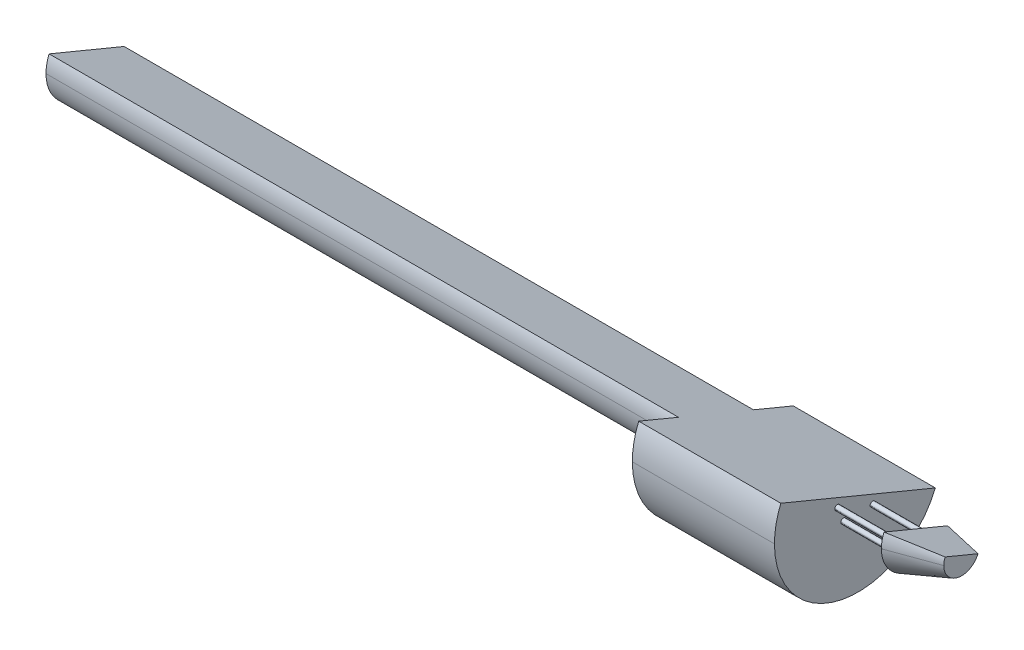
ISO-10303-21;
HEADER;
FILE_DESCRIPTION(('STEP AP214'),'2;1');
FILE_NAME('part.step','',(''),(''),'','','');
FILE_SCHEMA(('AUTOMOTIVE_DESIGN { 1 0 10303 214 1 1 1 1 }'));
ENDSEC;
DATA;
#1=APPLICATION_CONTEXT('core data for automotive mechanical design processes');
#2=APPLICATION_PROTOCOL_DEFINITION('international standard','automotive_design',2000,#1);
#3=PRODUCT_CONTEXT('',#1,'mechanical');
#4=PRODUCT('Part','Part','',(#3));
#5=PRODUCT_RELATED_PRODUCT_CATEGORY('part','',(#4));
#6=PRODUCT_DEFINITION_FORMATION('','',#4);
#7=PRODUCT_DEFINITION_CONTEXT('part definition',#1,'design');
#8=PRODUCT_DEFINITION('design','',#6,#7);
#9=PRODUCT_DEFINITION_SHAPE('','',#8);
#10=(LENGTH_UNIT() NAMED_UNIT(*) SI_UNIT(.MILLI.,.METRE.));
#11=(NAMED_UNIT(*) PLANE_ANGLE_UNIT() SI_UNIT($,.RADIAN.));
#12=(NAMED_UNIT(*) SI_UNIT($,.STERADIAN.) SOLID_ANGLE_UNIT());
#13=UNCERTAINTY_MEASURE_WITH_UNIT(LENGTH_MEASURE(1.E-05),#10,'distance_accuracy_value','');
#14=(GEOMETRIC_REPRESENTATION_CONTEXT(3) GLOBAL_UNCERTAINTY_ASSIGNED_CONTEXT((#13)) GLOBAL_UNIT_ASSIGNED_CONTEXT((#10,
#11,#12)) REPRESENTATION_CONTEXT('',''));
#15=CARTESIAN_POINT('',(0.,0.,0.));
#16=DIRECTION('',(0.,0.,1.));
#17=DIRECTION('',(1.,0.,0.));
#18=AXIS2_PLACEMENT_3D('',#15,#16,#17);
#19=CARTESIAN_POINT('',(0.,0.,0.));
#20=DIRECTION('',(0.,0.923879532511287,-0.382683432365091));
#21=DIRECTION('',(0.,0.382683432365091,0.923879532511286));
#22=AXIS2_PLACEMENT_3D('',#19,#20,#21);
#23=PLANE('',#22);
#24=DIRECTION('',(-0.939692506121897,-0.130885562945162,-0.315985701181046));
#25=VECTOR('',#24,1.);
#26=CARTESIAN_POINT('',(288.949201951219,0.,0.));
#27=LINE('',#26,#25);
#28=CARTESIAN_POINT('',(259.36,-4.12134749319908,-9.94981301333355));
#29=VERTEX_POINT('',#28);
#30=CARTESIAN_POINT('',(273.6661,-2.12871486087405,-5.13917228754728));
#31=VERTEX_POINT('',#30);
#32=EDGE_CURVE('E566',#29,#31,#27,.F.);
#33=ORIENTED_EDGE('',*,*,#32,.F.);
#34=DIRECTION('',(0.,-0.382683432365091,-0.923879532511286));
#35=VECTOR('',#34,1.);
#36=CARTESIAN_POINT('',(259.36,1.57717140466669,3.80762859533333));
#37=LINE('',#36,#35);
#38=CARTESIAN_POINT('',(259.36,4.12134749319908,9.94981301333355));
#39=VERTEX_POINT('',#38);
#40=EDGE_CURVE('E560',#39,#29,#37,.T.);
#41=ORIENTED_EDGE('',*,*,#40,.F.);
#42=DIRECTION('',(0.939692506121897,-0.130885562945162,-0.315985701181046));
#43=VECTOR('',#42,1.);
#44=CARTESIAN_POINT('',(288.949201951219,0.,0.));
#45=LINE('',#44,#43);
#46=CARTESIAN_POINT('',(273.6661,2.12871486087405,5.13917228754728));
#47=VERTEX_POINT('',#46);
#48=EDGE_CURVE('E556',#47,#39,#45,.F.);
#49=ORIENTED_EDGE('',*,*,#48,.F.);
#50=DIRECTION('',(0.,-0.382683432365091,-0.923879532511286));
#51=VECTOR('',#50,1.);
#52=CARTESIAN_POINT('',(273.6661,0.,0.));
#53=LINE('',#52,#51);
#54=EDGE_CURVE('E318',#47,#31,#53,.T.);
#55=ORIENTED_EDGE('',*,*,#54,.T.);
#56=EDGE_LOOP('',(#33,#41,#49,#55));
#57=FACE_BOUND('',#56,.T.);
#58=ADVANCED_FACE('F60',(#57),#23,.T.);
#59=DIRECTION('',(-1.,0.,0.));
#60=VECTOR('',#59,1.);
#61=CARTESIAN_POINT('',(0.,10.0117639575355,24.1705363295603));
#62=LINE('',#61,#60);
#63=CARTESIAN_POINT('',(241.3,10.0117639575355,24.1705363295603));
#64=VERTEX_POINT('',#63);
#65=CARTESIAN_POINT('',(196.85,10.0117639575355,24.1705363295603));
#66=VERTEX_POINT('',#65);
#67=EDGE_CURVE('E581',#64,#66,#62,.T.);
#68=ORIENTED_EDGE('',*,*,#67,.F.);
#69=DIRECTION('',(0.,0.382683432365091,0.923879532511286));
#70=VECTOR('',#69,1.);
#71=CARTESIAN_POINT('',(241.3,3.83133619529879,9.24966380470124));
#72=LINE('',#71,#70);
#73=CARTESIAN_POINT('',(241.3,-10.0117639575355,-24.1705363295603));
#74=VERTEX_POINT('',#73);
#75=EDGE_CURVE('E563',#74,#64,#72,.T.);
#76=ORIENTED_EDGE('',*,*,#75,.F.);
#77=DIRECTION('',(-1.,0.,0.));
#78=VECTOR('',#77,1.);
#79=CARTESIAN_POINT('',(0.,-10.0117639575355,-24.1705363295603));
#80=LINE('',#79,#78);
#81=CARTESIAN_POINT('',(196.85,-10.0117639575355,-24.1705363295603));
#82=VERTEX_POINT('',#81);
#83=EDGE_CURVE('E569',#82,#74,#80,.F.);
#84=ORIENTED_EDGE('',*,*,#83,.F.);
#85=DIRECTION('',(0.,-0.382683432365091,-0.923879532511286));
#86=VECTOR('',#85,1.);
#87=CARTESIAN_POINT('',(196.85,1.85987193946543,4.49012806053458));
#88=LINE('',#87,#86);
#89=CARTESIAN_POINT('',(196.85,-4.86007959103665,-11.7332700628933));
#90=VERTEX_POINT('',#89);
#91=EDGE_CURVE('E580',#90,#82,#88,.T.);
#92=ORIENTED_EDGE('',*,*,#91,.F.);
#93=DIRECTION('',(-1.,0.,0.));
#94=VECTOR('',#93,1.);
#95=CARTESIAN_POINT('',(0.,-4.86007959103665,-11.7332700628933));
#96=LINE('',#95,#94);
#97=CARTESIAN_POINT('',(0.,-4.86007959103665,-11.7332700628933));
#98=VERTEX_POINT('',#97);
#99=EDGE_CURVE('E571',#98,#90,#96,.F.);
#100=ORIENTED_EDGE('',*,*,#99,.F.);
#101=DIRECTION('',(0.,-0.382683432365091,-0.923879532511286));
#102=VECTOR('',#101,1.);
#103=CARTESIAN_POINT('',(0.,0.,0.));
#104=LINE('',#103,#102);
#105=CARTESIAN_POINT('',(0.,4.86007959103665,11.7332700628933));
#106=VERTEX_POINT('',#105);
#107=EDGE_CURVE('E143',#106,#98,#104,.T.);
#108=ORIENTED_EDGE('',*,*,#107,.F.);
#109=DIRECTION('',(-1.,0.,0.));
#110=VECTOR('',#109,1.);
#111=CARTESIAN_POINT('',(0.,4.86007959103665,11.7332700628933));
#112=LINE('',#111,#110);
#113=CARTESIAN_POINT('',(196.85,4.86007959103665,11.7332700628933));
#114=VERTEX_POINT('',#113);
#115=EDGE_CURVE('E576',#114,#106,#112,.T.);
#116=ORIENTED_EDGE('',*,*,#115,.F.);
#117=EDGE_CURVE('E578',#66,#114,#88,.T.);
#118=ORIENTED_EDGE('',*,*,#117,.F.);
#119=EDGE_LOOP('',(#68,#76,#84,#92,#100,#108,#116,#118));
#120=FACE_BOUND('',#119,.T.);
#121=ADVANCED_FACE('F416',(#120),#23,.T.);
#122=CARTESIAN_POINT('',(0.,0.,0.));
#123=DIRECTION('',(-1.,0.,0.));
#124=DIRECTION('',(0.,0.,1.));
#125=AXIS2_PLACEMENT_3D('',#122,#123,#124);
#126=CYLINDRICAL_SURFACE('',#125,12.7);
#127=CARTESIAN_POINT('',(0.,0.,0.));
#128=DIRECTION('',(-1.,0.,0.));
#129=DIRECTION('',(0.,0.,1.));
#130=AXIS2_PLACEMENT_3D('',#127,#128,#129);
#131=CIRCLE('',#130,12.7);
#132=CARTESIAN_POINT('',(0.,0.,12.7));
#133=VERTEX_POINT('',#132);
#134=EDGE_CURVE('E135',#98,#133,#131,.T.);
#135=ORIENTED_EDGE('',*,*,#134,.F.);
#136=ORIENTED_EDGE('',*,*,#99,.T.);
#137=CARTESIAN_POINT('',(196.85,0.,0.));
#138=DIRECTION('',(-1.,0.,0.));
#139=DIRECTION('',(0.,0.,1.));
#140=AXIS2_PLACEMENT_3D('',#137,#138,#139);
#141=CIRCLE('',#140,12.7);
#142=CARTESIAN_POINT('',(196.85,0.,12.7));
#143=VERTEX_POINT('',#142);
#144=EDGE_CURVE('E259',#143,#90,#141,.F.);
#145=ORIENTED_EDGE('',*,*,#144,.F.);
#146=DIRECTION('',(-1.,0.,0.));
#147=VECTOR('',#146,1.);
#148=CARTESIAN_POINT('',(0.,0.,12.7));
#149=LINE('',#148,#147);
#150=EDGE_CURVE('E286',#143,#133,#149,.T.);
#151=ORIENTED_EDGE('',*,*,#150,.T.);
#152=EDGE_LOOP('',(#135,#136,#145,#151));
#153=FACE_BOUND('',#152,.T.);
#154=ADVANCED_FACE('F413',(#153),#126,.T.);
#155=CARTESIAN_POINT('',(196.85,0.,0.));
#156=DIRECTION('',(-1.,0.,0.));
#157=DIRECTION('',(0.,0.,1.));
#158=AXIS2_PLACEMENT_3D('',#155,#156,#157);
#159=CIRCLE('',#158,12.7);
#160=EDGE_CURVE('E127',#114,#143,#159,.F.);
#161=ORIENTED_EDGE('',*,*,#160,.F.);
#162=ORIENTED_EDGE('',*,*,#115,.T.);
#163=EDGE_CURVE('E265',#133,#106,#131,.T.);
#164=ORIENTED_EDGE('',*,*,#163,.F.);
#165=ORIENTED_EDGE('',*,*,#150,.F.);
#166=EDGE_LOOP('',(#161,#162,#164,#165));
#167=FACE_BOUND('',#166,.T.);
#168=ADVANCED_FACE('F415',(#167),#126,.T.);
#169=CARTESIAN_POINT('',(0.,0.,0.));
#170=DIRECTION('',(-1.,0.,0.));
#171=DIRECTION('',(0.,0.,1.));
#172=AXIS2_PLACEMENT_3D('',#169,#170,#171);
#173=PLANE('',#172);
#174=ORIENTED_EDGE('',*,*,#163,.T.);
#175=ORIENTED_EDGE('',*,*,#107,.T.);
#176=ORIENTED_EDGE('',*,*,#134,.T.);
#177=EDGE_LOOP('',(#174,#175,#176));
#178=FACE_BOUND('',#177,.T.);
#179=ADVANCED_FACE('F62',(#178),#173,.T.);
#180=CARTESIAN_POINT('',(196.85,12.7,0.));
#181=DIRECTION('',(-1.,0.,0.));
#182=DIRECTION('',(0.,0.,1.));
#183=AXIS2_PLACEMENT_3D('',#180,#181,#182);
#184=PLANE('',#183);
#185=CARTESIAN_POINT('',(196.85,0.,0.));
#186=DIRECTION('',(-1.,0.,0.));
#187=DIRECTION('',(0.,0.,1.));
#188=AXIS2_PLACEMENT_3D('',#185,#186,#187);
#189=CIRCLE('',#188,26.162);
#190=CARTESIAN_POINT('',(196.85,0.,26.162));
#191=VERTEX_POINT('',#190);
#192=EDGE_CURVE('E308',#66,#191,#189,.F.);
#193=ORIENTED_EDGE('',*,*,#192,.F.);
#194=ORIENTED_EDGE('',*,*,#117,.T.);
#195=ORIENTED_EDGE('',*,*,#160,.T.);
#196=ORIENTED_EDGE('',*,*,#144,.T.);
#197=ORIENTED_EDGE('',*,*,#91,.T.);
#198=CARTESIAN_POINT('',(196.85,0.,0.));
#199=DIRECTION('',(-1.,0.,0.));
#200=DIRECTION('',(0.,0.,1.));
#201=AXIS2_PLACEMENT_3D('',#198,#199,#200);
#202=CIRCLE('',#201,26.162);
#203=EDGE_CURVE('E258',#191,#82,#202,.F.);
#204=ORIENTED_EDGE('',*,*,#203,.F.);
#205=EDGE_LOOP('',(#193,#194,#195,#196,#197,#204));
#206=FACE_BOUND('',#205,.T.);
#207=ADVANCED_FACE('F429',(#206),#184,.T.);
#208=CARTESIAN_POINT('',(0.,0.,0.));
#209=DIRECTION('',(-1.,0.,0.));
#210=DIRECTION('',(0.,0.,1.));
#211=AXIS2_PLACEMENT_3D('',#208,#209,#210);
#212=CYLINDRICAL_SURFACE('',#211,26.162);
#213=CARTESIAN_POINT('',(241.3,0.,0.));
#214=DIRECTION('',(-1.,0.,0.));
#215=DIRECTION('',(0.,0.,1.));
#216=AXIS2_PLACEMENT_3D('',#213,#214,#215);
#217=CIRCLE('',#216,26.162);
#218=CARTESIAN_POINT('',(241.3,0.,26.162));
#219=VERTEX_POINT('',#218);
#220=EDGE_CURVE('E311',#64,#219,#217,.F.);
#221=ORIENTED_EDGE('',*,*,#220,.F.);
#222=ORIENTED_EDGE('',*,*,#67,.T.);
#223=ORIENTED_EDGE('',*,*,#192,.T.);
#224=DIRECTION('',(-1.,0.,0.));
#225=VECTOR('',#224,1.);
#226=CARTESIAN_POINT('',(0.,0.,26.162));
#227=LINE('',#226,#225);
#228=EDGE_CURVE('E254',#219,#191,#227,.T.);
#229=ORIENTED_EDGE('',*,*,#228,.F.);
#230=EDGE_LOOP('',(#221,#222,#223,#229));
#231=FACE_BOUND('',#230,.T.);
#232=ADVANCED_FACE('F431',(#231),#212,.T.);
#233=ORIENTED_EDGE('',*,*,#203,.T.);
#234=ORIENTED_EDGE('',*,*,#83,.T.);
#235=CARTESIAN_POINT('',(241.3,0.,0.));
#236=DIRECTION('',(-1.,0.,0.));
#237=DIRECTION('',(0.,0.,1.));
#238=AXIS2_PLACEMENT_3D('',#235,#236,#237);
#239=CIRCLE('',#238,26.162);
#240=EDGE_CURVE('E264',#219,#74,#239,.F.);
#241=ORIENTED_EDGE('',*,*,#240,.F.);
#242=ORIENTED_EDGE('',*,*,#228,.T.);
#243=EDGE_LOOP('',(#233,#234,#241,#242));
#244=FACE_BOUND('',#243,.T.);
#245=ADVANCED_FACE('F428',(#244),#212,.T.);
#246=CARTESIAN_POINT('',(273.6671,-4.57993062174566,-4.57993062174433));
#247=DIRECTION('',(-1.,0.,0.));
#248=DIRECTION('',(0.,0.,1.));
#249=AXIS2_PLACEMENT_3D('',#246,#247,#248);
#250=CYLINDRICAL_SURFACE('',#249,0.806450000001067);
#251=DIRECTION('',(-1.,0.,0.));
#252=VECTOR('',#251,1.);
#253=CARTESIAN_POINT('',(273.6671,-4.57993062174566,-5.38638062174539));
#254=LINE('',#253,#252);
#255=CARTESIAN_POINT('',(259.36,-4.57993062174566,-5.38638062174539));
#256=VERTEX_POINT('',#255);
#257=CARTESIAN_POINT('',(241.3,-4.57993062174566,-5.38638062174539));
#258=VERTEX_POINT('',#257);
#259=EDGE_CURVE('E327',#256,#258,#254,.T.);
#260=ORIENTED_EDGE('',*,*,#259,.T.);
#261=CARTESIAN_POINT('',(241.3,-4.57993062174566,-4.57993062174433));
#262=DIRECTION('',(-1.,0.,0.));
#263=DIRECTION('',(0.,0.,1.));
#264=AXIS2_PLACEMENT_3D('',#261,#262,#263);
#265=CIRCLE('',#264,0.806450000001067);
#266=CARTESIAN_POINT('',(241.3,-4.57993062174566,-3.77348062174326));
#267=VERTEX_POINT('',#266);
#268=EDGE_CURVE('E216',#258,#267,#265,.F.);
#269=ORIENTED_EDGE('',*,*,#268,.T.);
#270=DIRECTION('',(-1.,0.,0.));
#271=VECTOR('',#270,1.);
#272=CARTESIAN_POINT('',(273.6671,-4.57993062174566,-3.77348062174326));
#273=LINE('',#272,#271);
#274=CARTESIAN_POINT('',(259.36,-4.57993062174566,-3.77348062174326));
#275=VERTEX_POINT('',#274);
#276=EDGE_CURVE('E359',#275,#267,#273,.T.);
#277=ORIENTED_EDGE('',*,*,#276,.F.);
#278=CARTESIAN_POINT('',(259.36,-4.57993062174566,-4.57993062174433));
#279=DIRECTION('',(1.,0.,0.));
#280=DIRECTION('',(0.,0.,1.));
#281=AXIS2_PLACEMENT_3D('',#278,#279,#280);
#282=CIRCLE('',#281,0.806450000001067);
#283=EDGE_CURVE('E207',#275,#256,#282,.F.);
#284=ORIENTED_EDGE('',*,*,#283,.T.);
#285=EDGE_LOOP('',(#260,#269,#277,#284));
#286=FACE_BOUND('',#285,.T.);
#287=ADVANCED_FACE('F447',(#286),#250,.T.);
#288=CARTESIAN_POINT('',(259.36,-4.57993062174566,-4.57993062174433));
#289=DIRECTION('',(1.,0.,0.));
#290=DIRECTION('',(0.,0.,1.));
#291=AXIS2_PLACEMENT_3D('',#288,#289,#290);
#292=CIRCLE('',#291,0.806450000001067);
#293=EDGE_CURVE('E337',#256,#275,#292,.F.);
#294=ORIENTED_EDGE('',*,*,#293,.T.);
#295=ORIENTED_EDGE('',*,*,#276,.T.);
#296=CARTESIAN_POINT('',(241.3,-4.57993062174566,-4.57993062174433));
#297=DIRECTION('',(-1.,0.,0.));
#298=DIRECTION('',(0.,0.,1.));
#299=AXIS2_PLACEMENT_3D('',#296,#297,#298);
#300=CIRCLE('',#299,0.806450000001067);
#301=EDGE_CURVE('E362',#267,#258,#300,.F.);
#302=ORIENTED_EDGE('',*,*,#301,.T.);
#303=ORIENTED_EDGE('',*,*,#259,.F.);
#304=EDGE_LOOP('',(#294,#295,#302,#303));
#305=FACE_BOUND('',#304,.T.);
#306=ADVANCED_FACE('F450',(#305),#250,.T.);
#307=CARTESIAN_POINT('',(273.6671,-6.477,1.10214486068894E-12));
#308=DIRECTION('',(-1.,0.,0.));
#309=DIRECTION('',(0.,0.,1.));
#310=AXIS2_PLACEMENT_3D('',#307,#308,#309);
#311=CYLINDRICAL_SURFACE('',#310,0.806450000001097);
#312=DIRECTION('',(-1.,0.,0.));
#313=VECTOR('',#312,1.);
#314=CARTESIAN_POINT('',(273.6671,-6.477,-0.80645));
#315=LINE('',#314,#313);
#316=CARTESIAN_POINT('',(259.36,-6.477,-0.80645));
#317=VERTEX_POINT('',#316);
#318=CARTESIAN_POINT('',(241.3,-6.477,-0.80645));
#319=VERTEX_POINT('',#318);
#320=EDGE_CURVE('E346',#317,#319,#315,.T.);
#321=ORIENTED_EDGE('',*,*,#320,.T.);
#322=CARTESIAN_POINT('',(241.3,-6.477,1.10214486068894E-12));
#323=DIRECTION('',(-1.,0.,0.));
#324=DIRECTION('',(0.,0.,1.));
#325=AXIS2_PLACEMENT_3D('',#322,#323,#324);
#326=CIRCLE('',#325,0.806450000001097);
#327=CARTESIAN_POINT('',(241.3,-6.477,0.806450000002199));
#328=VERTEX_POINT('',#327);
#329=EDGE_CURVE('E213',#319,#328,#326,.F.);
#330=ORIENTED_EDGE('',*,*,#329,.T.);
#331=DIRECTION('',(-1.,0.,0.));
#332=VECTOR('',#331,1.);
#333=CARTESIAN_POINT('',(273.6671,-6.477,0.806450000002199));
#334=LINE('',#333,#332);
#335=CARTESIAN_POINT('',(259.36,-6.477,0.806450000002199));
#336=VERTEX_POINT('',#335);
#337=EDGE_CURVE('E341',#336,#328,#334,.T.);
#338=ORIENTED_EDGE('',*,*,#337,.F.);
#339=CARTESIAN_POINT('',(259.36,-6.477,1.10214486068894E-12));
#340=DIRECTION('',(1.,0.,0.));
#341=DIRECTION('',(0.,0.,1.));
#342=AXIS2_PLACEMENT_3D('',#339,#340,#341);
#343=CIRCLE('',#342,0.806450000001097);
#344=EDGE_CURVE('E175',#336,#317,#343,.F.);
#345=ORIENTED_EDGE('',*,*,#344,.T.);
#346=EDGE_LOOP('',(#321,#330,#338,#345));
#347=FACE_BOUND('',#346,.T.);
#348=ADVANCED_FACE('F452',(#347),#311,.T.);
#349=CARTESIAN_POINT('',(259.36,-6.477,1.10214486068894E-12));
#350=DIRECTION('',(1.,0.,0.));
#351=DIRECTION('',(0.,0.,1.));
#352=AXIS2_PLACEMENT_3D('',#349,#350,#351);
#353=CIRCLE('',#352,0.806450000001097);
#354=EDGE_CURVE('E186',#317,#336,#353,.F.);
#355=ORIENTED_EDGE('',*,*,#354,.T.);
#356=ORIENTED_EDGE('',*,*,#337,.T.);
#357=CARTESIAN_POINT('',(241.3,-6.477,1.10214486068894E-12));
#358=DIRECTION('',(-1.,0.,0.));
#359=DIRECTION('',(0.,0.,1.));
#360=AXIS2_PLACEMENT_3D('',#357,#358,#359);
#361=CIRCLE('',#360,0.806450000001097);
#362=EDGE_CURVE('E244',#328,#319,#361,.F.);
#363=ORIENTED_EDGE('',*,*,#362,.T.);
#364=ORIENTED_EDGE('',*,*,#320,.F.);
#365=EDGE_LOOP('',(#355,#356,#363,#364));
#366=FACE_BOUND('',#365,.T.);
#367=ADVANCED_FACE('F454',(#366),#311,.T.);
#368=CARTESIAN_POINT('',(273.6671,-4.57993062174488,4.57993062174621));
#369=DIRECTION('',(-1.,0.,0.));
#370=DIRECTION('',(0.,0.,1.));
#371=AXIS2_PLACEMENT_3D('',#368,#369,#370);
#372=CYLINDRICAL_SURFACE('',#371,0.806450000000818);
#373=DIRECTION('',(-1.,0.,0.));
#374=VECTOR('',#373,1.);
#375=CARTESIAN_POINT('',(273.6671,-4.57993062174488,3.77348062174539));
#376=LINE('',#375,#374);
#377=CARTESIAN_POINT('',(259.36,-4.57993062174488,3.77348062174539));
#378=VERTEX_POINT('',#377);
#379=CARTESIAN_POINT('',(241.3,-4.57993062174488,3.77348062174539));
#380=VERTEX_POINT('',#379);
#381=EDGE_CURVE('E189',#378,#380,#376,.T.);
#382=ORIENTED_EDGE('',*,*,#381,.T.);
#383=CARTESIAN_POINT('',(241.3,-4.57993062174488,4.57993062174621));
#384=DIRECTION('',(-1.,0.,0.));
#385=DIRECTION('',(0.,0.,1.));
#386=AXIS2_PLACEMENT_3D('',#383,#384,#385);
#387=CIRCLE('',#386,0.806450000000818);
#388=CARTESIAN_POINT('',(241.3,-4.57993062174488,5.38638062174703));
#389=VERTEX_POINT('',#388);
#390=EDGE_CURVE('E180',#380,#389,#387,.F.);
#391=ORIENTED_EDGE('',*,*,#390,.T.);
#392=DIRECTION('',(-1.,0.,0.));
#393=VECTOR('',#392,1.);
#394=CARTESIAN_POINT('',(273.6671,-4.57993062174488,5.38638062174703));
#395=LINE('',#394,#393);
#396=CARTESIAN_POINT('',(259.36,-4.57993062174488,5.38638062174703));
#397=VERTEX_POINT('',#396);
#398=EDGE_CURVE('E178',#397,#389,#395,.T.);
#399=ORIENTED_EDGE('',*,*,#398,.F.);
#400=CARTESIAN_POINT('',(259.36,-4.57993062174488,4.57993062174621));
#401=DIRECTION('',(1.,0.,0.));
#402=DIRECTION('',(0.,0.,1.));
#403=AXIS2_PLACEMENT_3D('',#400,#401,#402);
#404=CIRCLE('',#403,0.806450000000818);
#405=EDGE_CURVE('E165',#397,#378,#404,.F.);
#406=ORIENTED_EDGE('',*,*,#405,.T.);
#407=EDGE_LOOP('',(#382,#391,#399,#406));
#408=FACE_BOUND('',#407,.T.);
#409=ADVANCED_FACE('F179',(#408),#372,.T.);
#410=CARTESIAN_POINT('',(259.36,-4.57993062174488,4.57993062174621));
#411=DIRECTION('',(1.,0.,0.));
#412=DIRECTION('',(0.,0.,1.));
#413=AXIS2_PLACEMENT_3D('',#410,#411,#412);
#414=CIRCLE('',#413,0.806450000000818);
#415=EDGE_CURVE('E170',#378,#397,#414,.F.);
#416=ORIENTED_EDGE('',*,*,#415,.T.);
#417=ORIENTED_EDGE('',*,*,#398,.T.);
#418=CARTESIAN_POINT('',(241.3,-4.57993062174488,4.57993062174621));
#419=DIRECTION('',(-1.,0.,0.));
#420=DIRECTION('',(0.,0.,1.));
#421=AXIS2_PLACEMENT_3D('',#418,#419,#420);
#422=CIRCLE('',#421,0.806450000000818);
#423=EDGE_CURVE('E185',#389,#380,#422,.F.);
#424=ORIENTED_EDGE('',*,*,#423,.T.);
#425=ORIENTED_EDGE('',*,*,#381,.F.);
#426=EDGE_LOOP('',(#416,#417,#424,#425));
#427=FACE_BOUND('',#426,.T.);
#428=ADVANCED_FACE('F188',(#427),#372,.T.);
#429=CARTESIAN_POINT('',(273.6671,5.51072430344469E-13,6.47700000000055));
#430=DIRECTION('',(-1.,0.,0.));
#431=DIRECTION('',(0.,0.,1.));
#432=AXIS2_PLACEMENT_3D('',#429,#430,#431);
#433=CYLINDRICAL_SURFACE('',#432,0.806450000000388);
#434=DIRECTION('',(-1.,0.,0.));
#435=VECTOR('',#434,1.);
#436=CARTESIAN_POINT('',(273.6671,5.51171191985586E-13,5.67055000000016));
#437=LINE('',#436,#435);
#438=CARTESIAN_POINT('',(259.36,5.51171191985586E-13,5.67055000000016));
#439=VERTEX_POINT('',#438);
#440=CARTESIAN_POINT('',(241.3,5.51171191985586E-13,5.67055000000016));
#441=VERTEX_POINT('',#440);
#442=EDGE_CURVE('E71',#439,#441,#437,.T.);
#443=ORIENTED_EDGE('',*,*,#442,.T.);
#444=CARTESIAN_POINT('',(241.3,5.51072430344469E-13,6.47700000000055));
#445=DIRECTION('',(-1.,0.,0.));
#446=DIRECTION('',(0.,0.,1.));
#447=AXIS2_PLACEMENT_3D('',#444,#445,#446);
#448=CIRCLE('',#447,0.806450000000388);
#449=CARTESIAN_POINT('',(241.3,5.51072430344469E-13,7.28345000000094));
#450=VERTEX_POINT('',#449);
#451=EDGE_CURVE('E225',#441,#450,#448,.F.);
#452=ORIENTED_EDGE('',*,*,#451,.T.);
#453=DIRECTION('',(-1.,0.,0.));
#454=VECTOR('',#453,1.);
#455=CARTESIAN_POINT('',(273.6671,5.51072430344469E-13,7.28345000000094));
#456=LINE('',#455,#454);
#457=CARTESIAN_POINT('',(259.36,5.51072430344469E-13,7.28345000000094));
#458=VERTEX_POINT('',#457);
#459=EDGE_CURVE('E191',#458,#450,#456,.T.);
#460=ORIENTED_EDGE('',*,*,#459,.F.);
#461=CARTESIAN_POINT('',(259.36,5.51072430344469E-13,6.47700000000055));
#462=DIRECTION('',(1.,0.,0.));
#463=DIRECTION('',(0.,0.,1.));
#464=AXIS2_PLACEMENT_3D('',#461,#462,#463);
#465=CIRCLE('',#464,0.806450000000388);
#466=EDGE_CURVE('E79',#458,#439,#465,.F.);
#467=ORIENTED_EDGE('',*,*,#466,.T.);
#468=EDGE_LOOP('',(#443,#452,#460,#467));
#469=FACE_BOUND('',#468,.T.);
#470=ADVANCED_FACE('F395',(#469),#433,.T.);
#471=CARTESIAN_POINT('',(259.36,5.51072430344469E-13,6.47700000000055));
#472=DIRECTION('',(1.,0.,0.));
#473=DIRECTION('',(0.,0.,1.));
#474=AXIS2_PLACEMENT_3D('',#471,#472,#473);
#475=CIRCLE('',#474,0.806450000000388);
#476=EDGE_CURVE('E11',#439,#458,#475,.F.);
#477=ORIENTED_EDGE('',*,*,#476,.T.);
#478=ORIENTED_EDGE('',*,*,#459,.T.);
#479=CARTESIAN_POINT('',(241.3,5.51072430344469E-13,6.47700000000055));
#480=DIRECTION('',(-1.,0.,0.));
#481=DIRECTION('',(0.,0.,1.));
#482=AXIS2_PLACEMENT_3D('',#479,#480,#481);
#483=CIRCLE('',#482,0.806450000000388);
#484=EDGE_CURVE('E198',#450,#441,#483,.F.);
#485=ORIENTED_EDGE('',*,*,#484,.T.);
#486=ORIENTED_EDGE('',*,*,#442,.F.);
#487=EDGE_LOOP('',(#477,#478,#485,#486));
#488=FACE_BOUND('',#487,.T.);
#489=ADVANCED_FACE('F401',(#488),#433,.T.);
#490=CARTESIAN_POINT('',(259.36,10.7696,0.));
#491=DIRECTION('',(-1.,0.,0.));
#492=DIRECTION('',(0.,0.,1.));
#493=AXIS2_PLACEMENT_3D('',#490,#491,#492);
#494=PLANE('',#493);
#495=ORIENTED_EDGE('',*,*,#476,.F.);
#496=ORIENTED_EDGE('',*,*,#466,.F.);
#497=EDGE_LOOP('',(#495,#496));
#498=FACE_BOUND('',#497,.T.);
#499=ORIENTED_EDGE('',*,*,#415,.F.);
#500=ORIENTED_EDGE('',*,*,#405,.F.);
#501=EDGE_LOOP('',(#499,#500));
#502=FACE_BOUND('',#501,.T.);
#503=ORIENTED_EDGE('',*,*,#354,.F.);
#504=ORIENTED_EDGE('',*,*,#344,.F.);
#505=EDGE_LOOP('',(#503,#504));
#506=FACE_BOUND('',#505,.T.);
#507=ORIENTED_EDGE('',*,*,#293,.F.);
#508=ORIENTED_EDGE('',*,*,#283,.F.);
#509=EDGE_LOOP('',(#507,#508));
#510=FACE_BOUND('',#509,.T.);
#511=CARTESIAN_POINT('',(259.36,0.,0.));
#512=DIRECTION('',(-1.,0.,0.));
#513=DIRECTION('',(0.,0.,1.));
#514=AXIS2_PLACEMENT_3D('',#511,#512,#513);
#515=CIRCLE('',#514,10.7696);
#516=CARTESIAN_POINT('',(259.36,0.,10.7696));
#517=VERTEX_POINT('',#516);
#518=EDGE_CURVE('E210',#39,#517,#515,.F.);
#519=ORIENTED_EDGE('',*,*,#518,.F.);
#520=ORIENTED_EDGE('',*,*,#40,.T.);
#521=CARTESIAN_POINT('',(259.36,0.,0.));
#522=DIRECTION('',(-1.,0.,0.));
#523=DIRECTION('',(0.,0.,1.));
#524=AXIS2_PLACEMENT_3D('',#521,#522,#523);
#525=CIRCLE('',#524,10.7696);
#526=EDGE_CURVE('E334',#517,#29,#525,.F.);
#527=ORIENTED_EDGE('',*,*,#526,.F.);
#528=EDGE_LOOP('',(#519,#520,#527));
#529=FACE_BOUND('',#528,.T.);
#530=ADVANCED_FACE('F167',(#498,#502,#506,#510,#529),#494,.T.);
#531=CARTESIAN_POINT('',(259.36,0.,0.));
#532=DIRECTION('',(-1.,0.,0.));
#533=DIRECTION('',(0.,0.,1.));
#534=AXIS2_PLACEMENT_3D('',#531,#532,#533);
#535=CONICAL_SURFACE('',#534,10.7696,0.349066185653853);
#536=ORIENTED_EDGE('',*,*,#526,.T.);
#537=ORIENTED_EDGE('',*,*,#32,.T.);
#538=CARTESIAN_POINT('',(273.6661,0.,0.));
#539=DIRECTION('',(-1.,0.,0.));
#540=DIRECTION('',(0.,0.,1.));
#541=AXIS2_PLACEMENT_3D('',#538,#539,#540);
#542=CIRCLE('',#541,5.5626);
#543=CARTESIAN_POINT('',(273.6661,0.,5.5626));
#544=VERTEX_POINT('',#543);
#545=EDGE_CURVE('E294',#31,#544,#542,.T.);
#546=ORIENTED_EDGE('',*,*,#545,.T.);
#547=DIRECTION('',(-0.939692506121897,0.,0.342020458362288));
#548=VECTOR('',#547,1.);
#549=CARTESIAN_POINT('',(259.36,0.,10.7696));
#550=LINE('',#549,#548);
#551=EDGE_CURVE('E276',#544,#517,#550,.T.);
#552=ORIENTED_EDGE('',*,*,#551,.T.);
#553=EDGE_LOOP('',(#536,#537,#546,#552));
#554=FACE_BOUND('',#553,.T.);
#555=ADVANCED_FACE('F403',(#554),#535,.T.);
#556=EDGE_CURVE('E322',#544,#47,#542,.T.);
#557=ORIENTED_EDGE('',*,*,#556,.T.);
#558=ORIENTED_EDGE('',*,*,#48,.T.);
#559=ORIENTED_EDGE('',*,*,#518,.T.);
#560=ORIENTED_EDGE('',*,*,#551,.F.);
#561=EDGE_LOOP('',(#557,#558,#559,#560));
#562=FACE_BOUND('',#561,.T.);
#563=ADVANCED_FACE('F409',(#562),#535,.T.);
#564=CARTESIAN_POINT('',(273.6661,0.,0.));
#565=DIRECTION('',(-1.,0.,0.));
#566=DIRECTION('',(0.,0.,1.));
#567=AXIS2_PLACEMENT_3D('',#564,#565,#566);
#568=PLANE('',#567);
#569=ORIENTED_EDGE('',*,*,#54,.F.);
#570=ORIENTED_EDGE('',*,*,#556,.F.);
#571=ORIENTED_EDGE('',*,*,#545,.F.);
#572=EDGE_LOOP('',(#569,#570,#571));
#573=FACE_BOUND('',#572,.T.);
#574=ADVANCED_FACE('F433',(#573),#568,.F.);
#575=CARTESIAN_POINT('',(241.3,26.162,0.));
#576=DIRECTION('',(1.,0.,0.));
#577=DIRECTION('',(0.,0.,-1.));
#578=AXIS2_PLACEMENT_3D('',#575,#576,#577);
#579=PLANE('',#578);
#580=ORIENTED_EDGE('',*,*,#451,.F.);
#581=ORIENTED_EDGE('',*,*,#484,.F.);
#582=EDGE_LOOP('',(#580,#581));
#583=FACE_BOUND('',#582,.T.);
#584=ORIENTED_EDGE('',*,*,#390,.F.);
#585=ORIENTED_EDGE('',*,*,#423,.F.);
#586=EDGE_LOOP('',(#584,#585));
#587=FACE_BOUND('',#586,.T.);
#588=ORIENTED_EDGE('',*,*,#329,.F.);
#589=ORIENTED_EDGE('',*,*,#362,.F.);
#590=EDGE_LOOP('',(#588,#589));
#591=FACE_BOUND('',#590,.T.);
#592=ORIENTED_EDGE('',*,*,#268,.F.);
#593=ORIENTED_EDGE('',*,*,#301,.F.);
#594=EDGE_LOOP('',(#592,#593));
#595=FACE_BOUND('',#594,.T.);
#596=ORIENTED_EDGE('',*,*,#240,.T.);
#597=ORIENTED_EDGE('',*,*,#75,.T.);
#598=ORIENTED_EDGE('',*,*,#220,.T.);
#599=EDGE_LOOP('',(#596,#597,#598));
#600=FACE_BOUND('',#599,.T.);
#601=ADVANCED_FACE('F398',(#583,#587,#591,#595,#600),#579,.T.);
#602=CLOSED_SHELL('',(#58,#121,#154,#168,#179,#207,#232,#245,#287,#306,#348,#367,#409,#428,#470,
#489,#530,#555,#563,#574,#601));
#603=MANIFOLD_SOLID_BREP('B2',#602);
#604=ADVANCED_BREP_SHAPE_REPRESENTATION('',(#18,#603),#14);
#605=SHAPE_DEFINITION_REPRESENTATION(#9,#604);
ENDSEC;
END-ISO-10303-21;
